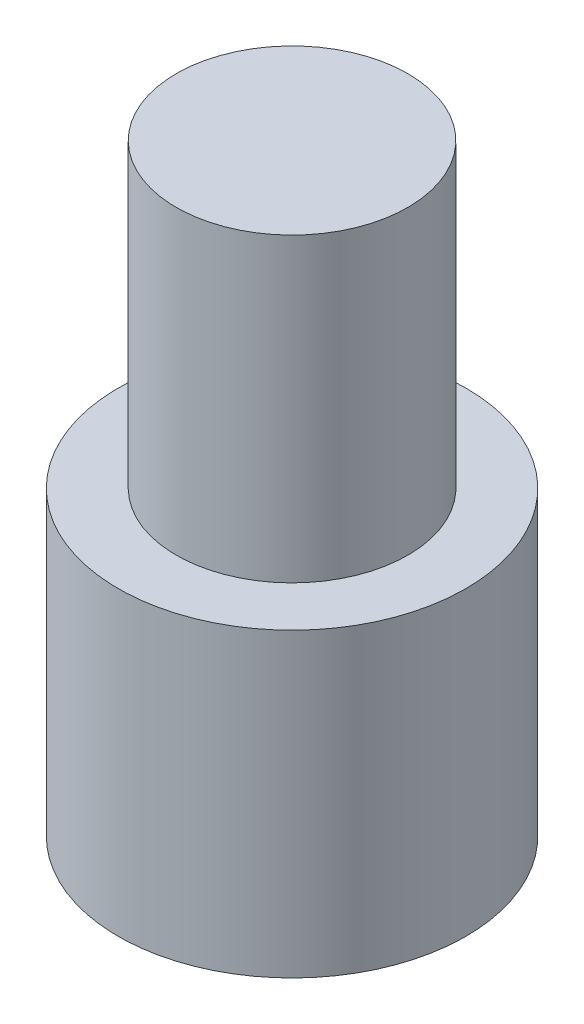
ISO-10303-21;
HEADER;
FILE_DESCRIPTION(('STEP AP214'),'2;1');
FILE_NAME('part.step','',(''),(''),'','','');
FILE_SCHEMA(('AUTOMOTIVE_DESIGN { 1 0 10303 214 1 1 1 1 }'));
ENDSEC;
DATA;
#1=APPLICATION_CONTEXT('core data for automotive mechanical design processes');
#2=APPLICATION_PROTOCOL_DEFINITION('international standard','automotive_design',2000,#1);
#3=PRODUCT_CONTEXT('',#1,'mechanical');
#4=PRODUCT('Part','Part','',(#3));
#5=PRODUCT_RELATED_PRODUCT_CATEGORY('part','',(#4));
#6=PRODUCT_DEFINITION_FORMATION('','',#4);
#7=PRODUCT_DEFINITION_CONTEXT('part definition',#1,'design');
#8=PRODUCT_DEFINITION('design','',#6,#7);
#9=PRODUCT_DEFINITION_SHAPE('','',#8);
#10=(LENGTH_UNIT() NAMED_UNIT(*) SI_UNIT(.MILLI.,.METRE.));
#11=(NAMED_UNIT(*) PLANE_ANGLE_UNIT() SI_UNIT($,.RADIAN.));
#12=(NAMED_UNIT(*) SI_UNIT($,.STERADIAN.) SOLID_ANGLE_UNIT());
#13=UNCERTAINTY_MEASURE_WITH_UNIT(LENGTH_MEASURE(1.E-05),#10,'distance_accuracy_value','');
#14=(GEOMETRIC_REPRESENTATION_CONTEXT(3) GLOBAL_UNCERTAINTY_ASSIGNED_CONTEXT((#13)) GLOBAL_UNIT_ASSIGNED_CONTEXT((#10,
#11,#12)) REPRESENTATION_CONTEXT('',''));
#15=CARTESIAN_POINT('',(0.,0.,0.));
#16=DIRECTION('',(0.,0.,1.));
#17=DIRECTION('',(1.,0.,0.));
#18=AXIS2_PLACEMENT_3D('',#15,#16,#17);
#19=CARTESIAN_POINT('',(-60.215324610857,13.,-24.3553853608954));
#20=DIRECTION('',(0.,-1.,0.));
#21=DIRECTION('',(0.,0.,-1.));
#22=AXIS2_PLACEMENT_3D('',#19,#20,#21);
#23=CYLINDRICAL_SURFACE('',#22,7.5);
#24=CARTESIAN_POINT('',(-60.215324610857,13.,-24.3553853608954));
#25=DIRECTION('',(0.,1.,0.));
#26=DIRECTION('',(0.,0.,1.));
#27=AXIS2_PLACEMENT_3D('',#24,#25,#26);
#28=CIRCLE('',#27,7.5);
#29=CARTESIAN_POINT('',(-60.215324610857,13.,-31.8553853608954));
#30=VERTEX_POINT('',#29);
#31=EDGE_CURVE('E40',#30,#30,#28,.T.);
#32=CARTESIAN_POINT('',(-60.215324610857,0.,-24.3553853608954));
#33=DIRECTION('',(0.,1.,0.));
#34=DIRECTION('',(0.,0.,1.));
#35=AXIS2_PLACEMENT_3D('',#32,#33,#34);
#36=CIRCLE('',#35,7.5);
#37=CARTESIAN_POINT('',(-60.215324610857,0.,-31.8553853608954));
#38=VERTEX_POINT('',#37);
#39=EDGE_CURVE('E36',#38,#38,#36,.T.);
#40=CARTESIAN_POINT('',(-60.215324610857,13.,-31.8553853608954));
#41=CARTESIAN_POINT('',(-60.215324610857,12.8645833333333,-31.8553853608954));
#42=CARTESIAN_POINT('',(-60.215324610857,12.7291666666667,-31.8553853608954));
#43=CARTESIAN_POINT('',(-60.215324610857,12.4583333333333,-31.8553853608954));
#44=CARTESIAN_POINT('',(-60.215324610857,12.3229166666667,-31.8553853608954));
#45=CARTESIAN_POINT('',(-60.215324610857,12.0520833333333,-31.8553853608954));
#46=CARTESIAN_POINT('',(-60.215324610857,11.9166666666667,-31.8553853608954));
#47=CARTESIAN_POINT('',(-60.215324610857,11.6458333333333,-31.8553853608954));
#48=CARTESIAN_POINT('',(-60.215324610857,11.5104166666667,-31.8553853608954));
#49=CARTESIAN_POINT('',(-60.215324610857,11.2395833333333,-31.8553853608954));
#50=CARTESIAN_POINT('',(-60.215324610857,11.1041666666667,-31.8553853608954));
#51=CARTESIAN_POINT('',(-60.215324610857,10.8333333333333,-31.8553853608954));
#52=CARTESIAN_POINT('',(-60.215324610857,10.6979166666667,-31.8553853608954));
#53=CARTESIAN_POINT('',(-60.215324610857,10.4270833333333,-31.8553853608954));
#54=CARTESIAN_POINT('',(-60.215324610857,10.2916666666667,-31.8553853608954));
#55=CARTESIAN_POINT('',(-60.215324610857,10.0208333333333,-31.8553853608954));
#56=CARTESIAN_POINT('',(-60.215324610857,9.88541666666667,-31.8553853608954));
#57=CARTESIAN_POINT('',(-60.215324610857,9.61458333333333,-31.8553853608954));
#58=CARTESIAN_POINT('',(-60.215324610857,9.47916666666667,-31.8553853608954));
#59=CARTESIAN_POINT('',(-60.215324610857,9.20833333333333,-31.8553853608954));
#60=CARTESIAN_POINT('',(-60.215324610857,9.07291666666666,-31.8553853608954));
#61=CARTESIAN_POINT('',(-60.215324610857,8.80208333333333,-31.8553853608954));
#62=CARTESIAN_POINT('',(-60.215324610857,8.66666666666667,-31.8553853608954));
#63=CARTESIAN_POINT('',(-60.215324610857,8.39583333333333,-31.8553853608954));
#64=CARTESIAN_POINT('',(-60.215324610857,8.26041666666667,-31.8553853608954));
#65=CARTESIAN_POINT('',(-60.215324610857,7.98958333333333,-31.8553853608954));
#66=CARTESIAN_POINT('',(-60.215324610857,7.85416666666667,-31.8553853608954));
#67=CARTESIAN_POINT('',(-60.215324610857,7.58333333333333,-31.8553853608954));
#68=CARTESIAN_POINT('',(-60.215324610857,7.44791666666667,-31.8553853608954));
#69=CARTESIAN_POINT('',(-60.215324610857,7.17708333333333,-31.8553853608954));
#70=CARTESIAN_POINT('',(-60.215324610857,7.04166666666667,-31.8553853608954));
#71=CARTESIAN_POINT('',(-60.215324610857,6.77083333333333,-31.8553853608954));
#72=CARTESIAN_POINT('',(-60.215324610857,6.63541666666667,-31.8553853608954));
#73=CARTESIAN_POINT('',(-60.215324610857,6.36458333333333,-31.8553853608954));
#74=CARTESIAN_POINT('',(-60.215324610857,6.22916666666667,-31.8553853608954));
#75=CARTESIAN_POINT('',(-60.215324610857,5.95833333333333,-31.8553853608954));
#76=CARTESIAN_POINT('',(-60.215324610857,5.82291666666667,-31.8553853608954));
#77=CARTESIAN_POINT('',(-60.215324610857,5.55208333333333,-31.8553853608954));
#78=CARTESIAN_POINT('',(-60.215324610857,5.41666666666667,-31.8553853608954));
#79=CARTESIAN_POINT('',(-60.215324610857,5.14583333333333,-31.8553853608954));
#80=CARTESIAN_POINT('',(-60.215324610857,5.01041666666667,-31.8553853608954));
#81=CARTESIAN_POINT('',(-60.215324610857,4.73958333333333,-31.8553853608954));
#82=CARTESIAN_POINT('',(-60.215324610857,4.60416666666667,-31.8553853608954));
#83=CARTESIAN_POINT('',(-60.215324610857,4.33333333333333,-31.8553853608954));
#84=CARTESIAN_POINT('',(-60.215324610857,4.19791666666667,-31.8553853608954));
#85=CARTESIAN_POINT('',(-60.215324610857,3.92708333333333,-31.8553853608954));
#86=CARTESIAN_POINT('',(-60.215324610857,3.79166666666667,-31.8553853608954));
#87=CARTESIAN_POINT('',(-60.215324610857,3.52083333333333,-31.8553853608954));
#88=CARTESIAN_POINT('',(-60.215324610857,3.38541666666667,-31.8553853608954));
#89=CARTESIAN_POINT('',(-60.215324610857,3.11458333333333,-31.8553853608954));
#90=CARTESIAN_POINT('',(-60.215324610857,2.97916666666667,-31.8553853608954));
#91=CARTESIAN_POINT('',(-60.215324610857,2.70833333333333,-31.8553853608954));
#92=CARTESIAN_POINT('',(-60.215324610857,2.57291666666667,-31.8553853608954));
#93=CARTESIAN_POINT('',(-60.215324610857,2.30208333333333,-31.8553853608954));
#94=CARTESIAN_POINT('',(-60.215324610857,2.16666666666667,-31.8553853608954));
#95=CARTESIAN_POINT('',(-60.215324610857,1.89583333333333,-31.8553853608954));
#96=CARTESIAN_POINT('',(-60.215324610857,1.76041666666667,-31.8553853608954));
#97=CARTESIAN_POINT('',(-60.215324610857,1.48958333333333,-31.8553853608954));
#98=CARTESIAN_POINT('',(-60.215324610857,1.35416666666667,-31.8553853608954));
#99=CARTESIAN_POINT('',(-60.215324610857,1.08333333333333,-31.8553853608954));
#100=CARTESIAN_POINT('',(-60.215324610857,0.947916666666667,-31.8553853608954));
#101=CARTESIAN_POINT('',(-60.215324610857,0.677083333333334,-31.8553853608954));
#102=CARTESIAN_POINT('',(-60.215324610857,0.541666666666667,-31.8553853608954));
#103=CARTESIAN_POINT('',(-60.215324610857,0.270833333333334,-31.8553853608954));
#104=CARTESIAN_POINT('',(-60.215324610857,0.135416666666667,-31.8553853608954));
#105=CARTESIAN_POINT('',(-60.215324610857,0.,-31.8553853608954));
#106=B_SPLINE_CURVE_WITH_KNOTS('',3,(#40,#41,#42,#43,#44,#45,#46,#47,#48,#49,#50,#51,#52,#53,
#54,#55,#56,#57,#58,#59,#60,#61,#62,#63,#64,#65,#66,#67,#68,#69,#70,#71,#72,#73,#74,#75,#76,#77,
#78,#79,#80,#81,#82,#83,#84,#85,#86,#87,#88,#89,#90,#91,#92,#93,#94,#95,#96,#97,#98,#99,#100,
#101,#102,#103,#104,#105),.UNSPECIFIED.,.F.,.F.,(4,2,2,2,2,2,2,2,2,2,2,2,2,2,2,2,2,2,2,2,2,2,2,
2,2,2,2,2,2,2,2,2,4),(0.,0.40625,0.812500000000001,1.21875,1.625,2.03125,2.4375,2.84375,3.25,
3.65625,4.0625,4.46875,4.875,5.28125,5.6875,6.09375,6.5,6.90625,7.3125,7.71875,8.125,8.53125,
8.9375,9.34375,9.75,10.15625,10.5625,10.96875,11.375,11.78125,12.1875,12.59375,13.),.UNSPECIFIED.);
#107=EDGE_CURVE('BSEAM33',#30,#38,#106,.T.);
#108=ORIENTED_EDGE('',*,*,#31,.F.);
#109=ORIENTED_EDGE('',*,*,#39,.T.);
#110=ORIENTED_EDGE('',*,*,#107,.T.);
#111=ORIENTED_EDGE('',*,*,#107,.F.);
#112=EDGE_LOOP('',(#108,#110,#109,#111));
#113=FACE_BOUND('',#112,.T.);
#114=ADVANCED_FACE('F33',(#113),#23,.T.);
#115=CARTESIAN_POINT('',(-60.215324610857,13.,-24.3553853608954));
#116=DIRECTION('',(0.,1.,0.));
#117=DIRECTION('',(0.,0.,1.));
#118=AXIS2_PLACEMENT_3D('',#115,#116,#117);
#119=PLANE('',#118);
#120=CARTESIAN_POINT('',(-60.215324610857,13.,-24.3553853608954));
#121=DIRECTION('',(0.,1.,0.));
#122=DIRECTION('',(0.,0.,1.));
#123=AXIS2_PLACEMENT_3D('',#120,#121,#122);
#124=CIRCLE('',#123,5.);
#125=CARTESIAN_POINT('',(-60.215324610857,13.,-29.3553853608954));
#126=VERTEX_POINT('',#125);
#127=EDGE_CURVE('E10',#126,#126,#124,.T.);
#128=ORIENTED_EDGE('',*,*,#127,.F.);
#129=EDGE_LOOP('',(#128));
#130=FACE_BOUND('',#129,.T.);
#131=ORIENTED_EDGE('',*,*,#31,.T.);
#132=EDGE_LOOP('',(#131));
#133=FACE_BOUND('',#132,.T.);
#134=ADVANCED_FACE('F69',(#130,#133),#119,.T.);
#135=CARTESIAN_POINT('',(-60.215324610857,0.,-24.3553853608954));
#136=DIRECTION('',(0.,1.,0.));
#137=DIRECTION('',(0.,0.,1.));
#138=AXIS2_PLACEMENT_3D('',#135,#136,#137);
#139=PLANE('',#138);
#140=CARTESIAN_POINT('',(-60.215324610857,0.,-24.3553853608954));
#141=DIRECTION('',(0.,-1.,0.));
#142=DIRECTION('',(0.,0.,-1.));
#143=AXIS2_PLACEMENT_3D('',#140,#141,#142);
#144=CIRCLE('',#143,3.);
#145=CARTESIAN_POINT('',(-60.215324610857,0.,-27.3553853608954));
#146=VERTEX_POINT('',#145);
#147=EDGE_CURVE('E50',#146,#146,#144,.T.);
#148=ORIENTED_EDGE('',*,*,#147,.F.);
#149=EDGE_LOOP('',(#148));
#150=FACE_BOUND('',#149,.T.);
#151=ORIENTED_EDGE('',*,*,#39,.F.);
#152=EDGE_LOOP('',(#151));
#153=FACE_BOUND('',#152,.T.);
#154=ADVANCED_FACE('F65',(#150,#153),#139,.F.);
#155=CARTESIAN_POINT('',(-60.215324610857,26.,-24.3553853608954));
#156=DIRECTION('',(0.,-1.,0.));
#157=DIRECTION('',(0.,0.,-1.));
#158=AXIS2_PLACEMENT_3D('',#155,#156,#157);
#159=CYLINDRICAL_SURFACE('',#158,5.);
#160=CARTESIAN_POINT('',(-60.215324610857,26.,-24.3553853608954));
#161=DIRECTION('',(0.,1.,0.));
#162=DIRECTION('',(0.,0.,1.));
#163=AXIS2_PLACEMENT_3D('',#160,#161,#162);
#164=CIRCLE('',#163,5.);
#165=CARTESIAN_POINT('',(-60.215324610857,26.,-29.3553853608954));
#166=VERTEX_POINT('',#165);
#167=EDGE_CURVE('E46',#166,#166,#164,.T.);
#168=CARTESIAN_POINT('',(-60.215324610857,26.,-29.3553853608954));
#169=CARTESIAN_POINT('',(-60.215324610857,25.8645833333333,-29.3553853608954));
#170=CARTESIAN_POINT('',(-60.215324610857,25.7291666666667,-29.3553853608954));
#171=CARTESIAN_POINT('',(-60.215324610857,25.4583333333333,-29.3553853608954));
#172=CARTESIAN_POINT('',(-60.215324610857,25.3229166666667,-29.3553853608954));
#173=CARTESIAN_POINT('',(-60.215324610857,25.0520833333333,-29.3553853608954));
#174=CARTESIAN_POINT('',(-60.215324610857,24.9166666666667,-29.3553853608954));
#175=CARTESIAN_POINT('',(-60.215324610857,24.6458333333333,-29.3553853608954));
#176=CARTESIAN_POINT('',(-60.215324610857,24.5104166666667,-29.3553853608954));
#177=CARTESIAN_POINT('',(-60.215324610857,24.2395833333333,-29.3553853608954));
#178=CARTESIAN_POINT('',(-60.215324610857,24.1041666666667,-29.3553853608954));
#179=CARTESIAN_POINT('',(-60.215324610857,23.8333333333333,-29.3553853608954));
#180=CARTESIAN_POINT('',(-60.215324610857,23.6979166666667,-29.3553853608954));
#181=CARTESIAN_POINT('',(-60.215324610857,23.4270833333333,-29.3553853608954));
#182=CARTESIAN_POINT('',(-60.215324610857,23.2916666666667,-29.3553853608954));
#183=CARTESIAN_POINT('',(-60.215324610857,23.0208333333333,-29.3553853608954));
#184=CARTESIAN_POINT('',(-60.215324610857,22.8854166666667,-29.3553853608954));
#185=CARTESIAN_POINT('',(-60.215324610857,22.6145833333333,-29.3553853608954));
#186=CARTESIAN_POINT('',(-60.215324610857,22.4791666666667,-29.3553853608954));
#187=CARTESIAN_POINT('',(-60.215324610857,22.2083333333333,-29.3553853608954));
#188=CARTESIAN_POINT('',(-60.215324610857,22.0729166666667,-29.3553853608954));
#189=CARTESIAN_POINT('',(-60.215324610857,21.8020833333333,-29.3553853608954));
#190=CARTESIAN_POINT('',(-60.215324610857,21.6666666666667,-29.3553853608954));
#191=CARTESIAN_POINT('',(-60.215324610857,21.3958333333333,-29.3553853608954));
#192=CARTESIAN_POINT('',(-60.215324610857,21.2604166666667,-29.3553853608954));
#193=CARTESIAN_POINT('',(-60.215324610857,20.9895833333333,-29.3553853608954));
#194=CARTESIAN_POINT('',(-60.215324610857,20.8541666666667,-29.3553853608954));
#195=CARTESIAN_POINT('',(-60.215324610857,20.5833333333333,-29.3553853608954));
#196=CARTESIAN_POINT('',(-60.215324610857,20.4479166666667,-29.3553853608954));
#197=CARTESIAN_POINT('',(-60.215324610857,20.1770833333333,-29.3553853608954));
#198=CARTESIAN_POINT('',(-60.215324610857,20.0416666666667,-29.3553853608954));
#199=CARTESIAN_POINT('',(-60.215324610857,19.7708333333333,-29.3553853608954));
#200=CARTESIAN_POINT('',(-60.215324610857,19.6354166666667,-29.3553853608954));
#201=CARTESIAN_POINT('',(-60.215324610857,19.3645833333333,-29.3553853608954));
#202=CARTESIAN_POINT('',(-60.215324610857,19.2291666666667,-29.3553853608954));
#203=CARTESIAN_POINT('',(-60.215324610857,18.9583333333333,-29.3553853608954));
#204=CARTESIAN_POINT('',(-60.215324610857,18.8229166666667,-29.3553853608954));
#205=CARTESIAN_POINT('',(-60.215324610857,18.5520833333333,-29.3553853608954));
#206=CARTESIAN_POINT('',(-60.215324610857,18.4166666666667,-29.3553853608954));
#207=CARTESIAN_POINT('',(-60.215324610857,18.1458333333333,-29.3553853608954));
#208=CARTESIAN_POINT('',(-60.215324610857,18.0104166666667,-29.3553853608954));
#209=CARTESIAN_POINT('',(-60.215324610857,17.7395833333333,-29.3553853608954));
#210=CARTESIAN_POINT('',(-60.215324610857,17.6041666666667,-29.3553853608954));
#211=CARTESIAN_POINT('',(-60.215324610857,17.3333333333333,-29.3553853608954));
#212=CARTESIAN_POINT('',(-60.215324610857,17.1979166666667,-29.3553853608954));
#213=CARTESIAN_POINT('',(-60.215324610857,16.9270833333333,-29.3553853608954));
#214=CARTESIAN_POINT('',(-60.215324610857,16.7916666666667,-29.3553853608954));
#215=CARTESIAN_POINT('',(-60.215324610857,16.5208333333333,-29.3553853608954));
#216=CARTESIAN_POINT('',(-60.215324610857,16.3854166666667,-29.3553853608954));
#217=CARTESIAN_POINT('',(-60.215324610857,16.1145833333333,-29.3553853608954));
#218=CARTESIAN_POINT('',(-60.215324610857,15.9791666666667,-29.3553853608954));
#219=CARTESIAN_POINT('',(-60.215324610857,15.7083333333333,-29.3553853608954));
#220=CARTESIAN_POINT('',(-60.215324610857,15.5729166666667,-29.3553853608954));
#221=CARTESIAN_POINT('',(-60.215324610857,15.3020833333333,-29.3553853608954));
#222=CARTESIAN_POINT('',(-60.215324610857,15.1666666666667,-29.3553853608954));
#223=CARTESIAN_POINT('',(-60.215324610857,14.8958333333333,-29.3553853608954));
#224=CARTESIAN_POINT('',(-60.215324610857,14.7604166666667,-29.3553853608954));
#225=CARTESIAN_POINT('',(-60.215324610857,14.4895833333333,-29.3553853608954));
#226=CARTESIAN_POINT('',(-60.215324610857,14.3541666666667,-29.3553853608954));
#227=CARTESIAN_POINT('',(-60.215324610857,14.0833333333333,-29.3553853608954));
#228=CARTESIAN_POINT('',(-60.215324610857,13.9479166666667,-29.3553853608954));
#229=CARTESIAN_POINT('',(-60.215324610857,13.6770833333333,-29.3553853608954));
#230=CARTESIAN_POINT('',(-60.215324610857,13.5416666666667,-29.3553853608954));
#231=CARTESIAN_POINT('',(-60.215324610857,13.2708333333333,-29.3553853608954));
#232=CARTESIAN_POINT('',(-60.215324610857,13.1354166666667,-29.3553853608954));
#233=CARTESIAN_POINT('',(-60.215324610857,13.,-29.3553853608954));
#234=B_SPLINE_CURVE_WITH_KNOTS('',3,(#168,#169,#170,#171,#172,#173,#174,#175,#176,#177,#178,
#179,#180,#181,#182,#183,#184,#185,#186,#187,#188,#189,#190,#191,#192,#193,#194,#195,#196,#197,
#198,#199,#200,#201,#202,#203,#204,#205,#206,#207,#208,#209,#210,#211,#212,#213,#214,#215,#216,
#217,#218,#219,#220,#221,#222,#223,#224,#225,#226,#227,#228,#229,#230,#231,#232,#233),
.UNSPECIFIED.,.F.,.F.,(4,2,2,2,2,2,2,2,2,2,2,2,2,2,2,2,2,2,2,2,2,2,2,2,2,2,2,2,2,2,2,2,4),(0.,
0.40625,0.812500000000001,1.21875,1.625,2.03125,2.4375,2.84375,3.25,3.65625,4.0625,4.46875,
4.875,5.28125,5.6875,6.09375,6.5,6.90625,7.3125,7.71875,8.125,8.53125,8.9375,9.34375,9.75,
10.15625,10.5625,10.96875,11.375,11.78125,12.1875,12.59375,13.),.UNSPECIFIED.);
#235=EDGE_CURVE('BSEAM68',#166,#126,#234,.T.);
#236=ORIENTED_EDGE('',*,*,#167,.F.);
#237=ORIENTED_EDGE('',*,*,#127,.T.);
#238=ORIENTED_EDGE('',*,*,#235,.T.);
#239=ORIENTED_EDGE('',*,*,#235,.F.);
#240=EDGE_LOOP('',(#236,#238,#237,#239));
#241=FACE_BOUND('',#240,.T.);
#242=ADVANCED_FACE('F68',(#241),#159,.T.);
#243=CARTESIAN_POINT('',(-60.215324610857,26.,-24.3553853608954));
#244=DIRECTION('',(0.,1.,0.));
#245=DIRECTION('',(0.,0.,1.));
#246=AXIS2_PLACEMENT_3D('',#243,#244,#245);
#247=PLANE('',#246);
#248=ORIENTED_EDGE('',*,*,#167,.T.);
#249=EDGE_LOOP('',(#248));
#250=FACE_BOUND('',#249,.T.);
#251=ADVANCED_FACE('F61',(#250),#247,.T.);
#252=CARTESIAN_POINT('',(-60.215324610857,11.,-24.3553853608954));
#253=DIRECTION('',(0.,-1.,0.));
#254=DIRECTION('',(0.,0.,-1.));
#255=AXIS2_PLACEMENT_3D('',#252,#253,#254);
#256=CYLINDRICAL_SURFACE('',#255,3.);
#257=CARTESIAN_POINT('',(-60.215324610857,11.,-24.3553853608954));
#258=DIRECTION('',(0.,-1.,0.));
#259=DIRECTION('',(0.,0.,-1.));
#260=AXIS2_PLACEMENT_3D('',#257,#258,#259);
#261=CIRCLE('',#260,3.);
#262=CARTESIAN_POINT('',(-60.215324610857,11.,-27.3553853608954));
#263=VERTEX_POINT('',#262);
#264=EDGE_CURVE('E49',#263,#263,#261,.T.);
#265=ORIENTED_EDGE('',*,*,#264,.F.);
#266=EDGE_LOOP('',(#265));
#267=FACE_BOUND('',#266,.T.);
#268=ORIENTED_EDGE('',*,*,#147,.T.);
#269=EDGE_LOOP('',(#268));
#270=FACE_BOUND('',#269,.T.);
#271=ADVANCED_FACE('F58',(#267,#270),#256,.F.);
#272=CARTESIAN_POINT('',(-60.215324610857,11.,-24.3553853608954));
#273=DIRECTION('',(0.,-1.,0.));
#274=DIRECTION('',(0.,0.,-1.));
#275=AXIS2_PLACEMENT_3D('',#272,#273,#274);
#276=PLANE('',#275);
#277=ORIENTED_EDGE('',*,*,#264,.T.);
#278=EDGE_LOOP('',(#277));
#279=FACE_BOUND('',#278,.T.);
#280=ADVANCED_FACE('F56',(#279),#276,.T.);
#281=CLOSED_SHELL('',(#114,#134,#154,#242,#251,#271,#280));
#282=MANIFOLD_SOLID_BREP('B2',#281);
#283=ADVANCED_BREP_SHAPE_REPRESENTATION('',(#18,#282),#14);
#284=SHAPE_DEFINITION_REPRESENTATION(#9,#283);
ENDSEC;
END-ISO-10303-21;
